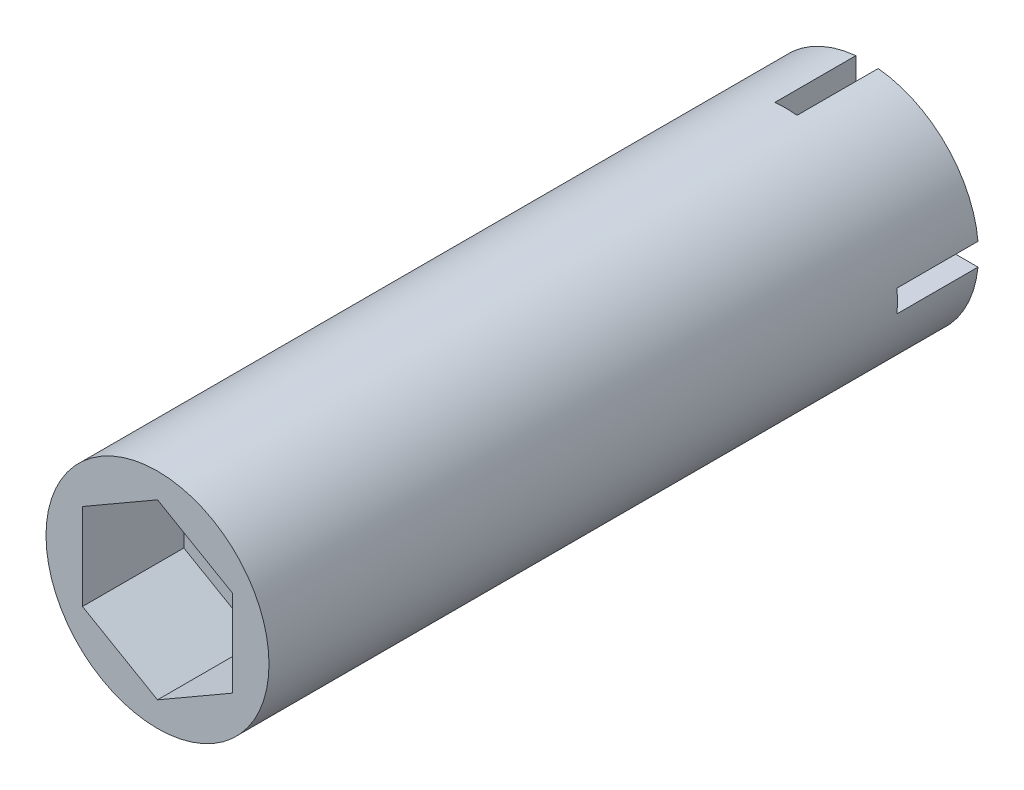
ISO-10303-21;
HEADER;
FILE_DESCRIPTION(('STEP AP214'),'2;1');
FILE_NAME('part.step','',(''),(''),'','','');
FILE_SCHEMA(('AUTOMOTIVE_DESIGN { 1 0 10303 214 1 1 1 1 }'));
ENDSEC;
DATA;
#1=APPLICATION_CONTEXT('core data for automotive mechanical design processes');
#2=APPLICATION_PROTOCOL_DEFINITION('international standard','automotive_design',2000,#1);
#3=PRODUCT_CONTEXT('',#1,'mechanical');
#4=PRODUCT('Part','Part','',(#3));
#5=PRODUCT_RELATED_PRODUCT_CATEGORY('part','',(#4));
#6=PRODUCT_DEFINITION_FORMATION('','',#4);
#7=PRODUCT_DEFINITION_CONTEXT('part definition',#1,'design');
#8=PRODUCT_DEFINITION('design','',#6,#7);
#9=PRODUCT_DEFINITION_SHAPE('','',#8);
#10=(LENGTH_UNIT() NAMED_UNIT(*) SI_UNIT(.MILLI.,.METRE.));
#11=(NAMED_UNIT(*) PLANE_ANGLE_UNIT() SI_UNIT($,.RADIAN.));
#12=(NAMED_UNIT(*) SI_UNIT($,.STERADIAN.) SOLID_ANGLE_UNIT());
#13=UNCERTAINTY_MEASURE_WITH_UNIT(LENGTH_MEASURE(1.E-05),#10,'distance_accuracy_value','');
#14=(GEOMETRIC_REPRESENTATION_CONTEXT(3) GLOBAL_UNCERTAINTY_ASSIGNED_CONTEXT((#13)) GLOBAL_UNIT_ASSIGNED_CONTEXT((#10,
#11,#12)) REPRESENTATION_CONTEXT('',''));
#15=CARTESIAN_POINT('',(0.,0.,0.));
#16=DIRECTION('',(0.,0.,1.));
#17=DIRECTION('',(1.,0.,0.));
#18=AXIS2_PLACEMENT_3D('',#15,#16,#17);
#19=CARTESIAN_POINT('',(0.,0.,0.));
#20=DIRECTION('',(0.,0.,1.));
#21=DIRECTION('',(1.,0.,0.));
#22=AXIS2_PLACEMENT_3D('',#19,#20,#21);
#23=PLANE('',#22);
#24=CARTESIAN_POINT('',(0.,0.,0.));
#25=DIRECTION('',(0.,0.,1.));
#26=DIRECTION('',(1.,0.,0.));
#27=AXIS2_PLACEMENT_3D('',#24,#25,#26);
#28=CIRCLE('',#27,2.25);
#29=CARTESIAN_POINT('',(2.18174242292714,0.55,0.));
#30=VERTEX_POINT('',#29);
#31=CARTESIAN_POINT('',(0.55,2.18174242292714,0.));
#32=VERTEX_POINT('',#31);
#33=EDGE_CURVE('E209',#30,#32,#28,.T.);
#34=ORIENTED_EDGE('',*,*,#33,.T.);
#35=DIRECTION('',(0.,-1.,0.));
#36=VECTOR('',#35,1.);
#37=CARTESIAN_POINT('',(0.55,5.5,0.));
#38=LINE('',#37,#36);
#39=CARTESIAN_POINT('',(0.55,5.47243090408641,0.));
#40=VERTEX_POINT('',#39);
#41=EDGE_CURVE('E193',#40,#32,#38,.T.);
#42=ORIENTED_EDGE('',*,*,#41,.F.);
#43=CARTESIAN_POINT('',(0.,0.,0.));
#44=DIRECTION('',(0.,0.,1.));
#45=DIRECTION('',(1.,0.,0.));
#46=AXIS2_PLACEMENT_3D('',#43,#44,#45);
#47=CIRCLE('',#46,5.5);
#48=CARTESIAN_POINT('',(5.47243090408641,0.55,0.));
#49=VERTEX_POINT('',#48);
#50=EDGE_CURVE('E207',#49,#40,#47,.T.);
#51=ORIENTED_EDGE('',*,*,#50,.F.);
#52=DIRECTION('',(1.,0.,0.));
#53=VECTOR('',#52,1.);
#54=CARTESIAN_POINT('',(5.5,0.55,0.));
#55=LINE('',#54,#53);
#56=EDGE_CURVE('E211',#30,#49,#55,.T.);
#57=ORIENTED_EDGE('',*,*,#56,.F.);
#58=EDGE_LOOP('',(#34,#42,#51,#57));
#59=FACE_BOUND('',#58,.T.);
#60=ADVANCED_FACE('F39',(#59),#23,.F.);
#61=CARTESIAN_POINT('',(-0.55,5.47243090408641,0.));
#62=VERTEX_POINT('',#61);
#63=CARTESIAN_POINT('',(-5.47243090408641,0.55,0.));
#64=VERTEX_POINT('',#63);
#65=EDGE_CURVE('E219',#62,#64,#47,.T.);
#66=ORIENTED_EDGE('',*,*,#65,.F.);
#67=DIRECTION('',(0.,1.,0.));
#68=VECTOR('',#67,1.);
#69=CARTESIAN_POINT('',(-0.55,5.5,0.));
#70=LINE('',#69,#68);
#71=CARTESIAN_POINT('',(-0.550000000000001,2.18174242292714,0.));
#72=VERTEX_POINT('',#71);
#73=EDGE_CURVE('E381',#72,#62,#70,.T.);
#74=ORIENTED_EDGE('',*,*,#73,.F.);
#75=CARTESIAN_POINT('',(-2.18174242292714,0.55,0.));
#76=VERTEX_POINT('',#75);
#77=EDGE_CURVE('E412',#72,#76,#28,.T.);
#78=ORIENTED_EDGE('',*,*,#77,.T.);
#79=DIRECTION('',(1.,0.,0.));
#80=VECTOR('',#79,1.);
#81=CARTESIAN_POINT('',(-0.550000000000001,0.55,0.));
#82=LINE('',#81,#80);
#83=EDGE_CURVE('E378',#64,#76,#82,.T.);
#84=ORIENTED_EDGE('',*,*,#83,.F.);
#85=EDGE_LOOP('',(#66,#74,#78,#84));
#86=FACE_BOUND('',#85,.T.);
#87=ADVANCED_FACE('F343',(#86),#23,.F.);
#88=CARTESIAN_POINT('',(-5.47243090408641,-0.55,0.));
#89=VERTEX_POINT('',#88);
#90=CARTESIAN_POINT('',(-0.550000000000001,-5.47243090408641,0.));
#91=VERTEX_POINT('',#90);
#92=EDGE_CURVE('E228',#89,#91,#47,.T.);
#93=ORIENTED_EDGE('',*,*,#92,.F.);
#94=DIRECTION('',(-1.,0.,0.));
#95=VECTOR('',#94,1.);
#96=CARTESIAN_POINT('',(-0.550000000000001,-0.55,0.));
#97=LINE('',#96,#95);
#98=CARTESIAN_POINT('',(-2.18174242292714,-0.55,0.));
#99=VERTEX_POINT('',#98);
#100=EDGE_CURVE('E375',#99,#89,#97,.T.);
#101=ORIENTED_EDGE('',*,*,#100,.F.);
#102=CARTESIAN_POINT('',(-0.550000000000001,-2.18174242292714,0.));
#103=VERTEX_POINT('',#102);
#104=EDGE_CURVE('E415',#99,#103,#28,.T.);
#105=ORIENTED_EDGE('',*,*,#104,.T.);
#106=DIRECTION('',(0.,1.,0.));
#107=VECTOR('',#106,1.);
#108=CARTESIAN_POINT('',(-0.550000000000001,-0.55,0.));
#109=LINE('',#108,#107);
#110=EDGE_CURVE('E369',#91,#103,#109,.T.);
#111=ORIENTED_EDGE('',*,*,#110,.F.);
#112=EDGE_LOOP('',(#93,#101,#105,#111));
#113=FACE_BOUND('',#112,.T.);
#114=ADVANCED_FACE('F339',(#113),#23,.F.);
#115=CARTESIAN_POINT('',(0.,0.,35.));
#116=DIRECTION('',(0.,0.,-1.));
#117=DIRECTION('',(-1.,0.,0.));
#118=AXIS2_PLACEMENT_3D('',#115,#116,#117);
#119=CYLINDRICAL_SURFACE('',#118,5.5);
#120=ORIENTED_EDGE('',*,*,#50,.T.);
#121=DIRECTION('',(0.,0.,-1.));
#122=VECTOR('',#121,1.);
#123=CARTESIAN_POINT('',(0.55,5.47243090408641,35.));
#124=LINE('',#123,#122);
#125=CARTESIAN_POINT('',(0.55,5.47243090408641,4.));
#126=VERTEX_POINT('',#125);
#127=EDGE_CURVE('E189',#40,#126,#124,.F.);
#128=ORIENTED_EDGE('',*,*,#127,.T.);
#129=CARTESIAN_POINT('',(0.,0.,4.));
#130=DIRECTION('',(0.,0.,-1.));
#131=DIRECTION('',(-1.,0.,0.));
#132=AXIS2_PLACEMENT_3D('',#129,#130,#131);
#133=CIRCLE('',#132,5.5);
#134=CARTESIAN_POINT('',(-0.55,5.47243090408641,4.));
#135=VERTEX_POINT('',#134);
#136=EDGE_CURVE('E384',#135,#126,#133,.T.);
#137=ORIENTED_EDGE('',*,*,#136,.F.);
#138=DIRECTION('',(0.,0.,-1.));
#139=VECTOR('',#138,1.);
#140=CARTESIAN_POINT('',(-0.55,5.47243090408641,35.));
#141=LINE('',#140,#139);
#142=EDGE_CURVE('E201',#135,#62,#141,.T.);
#143=ORIENTED_EDGE('',*,*,#142,.T.);
#144=ORIENTED_EDGE('',*,*,#65,.T.);
#145=DIRECTION('',(0.,0.,-1.));
#146=VECTOR('',#145,1.);
#147=CARTESIAN_POINT('',(-5.47243090408641,0.55,35.));
#148=LINE('',#147,#146);
#149=CARTESIAN_POINT('',(-5.47243090408641,0.55,4.));
#150=VERTEX_POINT('',#149);
#151=EDGE_CURVE('E405',#64,#150,#148,.F.);
#152=ORIENTED_EDGE('',*,*,#151,.T.);
#153=CARTESIAN_POINT('',(-5.47243090408641,-0.55,4.));
#154=VERTEX_POINT('',#153);
#155=EDGE_CURVE('E388',#154,#150,#133,.T.);
#156=ORIENTED_EDGE('',*,*,#155,.F.);
#157=DIRECTION('',(0.,0.,-1.));
#158=VECTOR('',#157,1.);
#159=CARTESIAN_POINT('',(-5.47243090408641,-0.55,35.));
#160=LINE('',#159,#158);
#161=EDGE_CURVE('E401',#154,#89,#160,.T.);
#162=ORIENTED_EDGE('',*,*,#161,.T.);
#163=ORIENTED_EDGE('',*,*,#92,.T.);
#164=DIRECTION('',(0.,0.,-1.));
#165=VECTOR('',#164,1.);
#166=CARTESIAN_POINT('',(-0.550000000000001,-5.47243090408641,35.));
#167=LINE('',#166,#165);
#168=CARTESIAN_POINT('',(-0.550000000000001,-5.47243090408641,4.));
#169=VERTEX_POINT('',#168);
#170=EDGE_CURVE('E397',#91,#169,#167,.F.);
#171=ORIENTED_EDGE('',*,*,#170,.T.);
#172=CARTESIAN_POINT('',(0.549999999999998,-5.47243090408641,4.));
#173=VERTEX_POINT('',#172);
#174=EDGE_CURVE('E604',#173,#169,#133,.T.);
#175=ORIENTED_EDGE('',*,*,#174,.F.);
#176=DIRECTION('',(0.,0.,-1.));
#177=VECTOR('',#176,1.);
#178=CARTESIAN_POINT('',(0.549999999999998,-5.47243090408641,35.));
#179=LINE('',#178,#177);
#180=CARTESIAN_POINT('',(0.549999999999998,-5.47243090408641,0.));
#181=VERTEX_POINT('',#180);
#182=EDGE_CURVE('E394',#173,#181,#179,.T.);
#183=ORIENTED_EDGE('',*,*,#182,.T.);
#184=CARTESIAN_POINT('',(5.47243090408641,-0.55,0.));
#185=VERTEX_POINT('',#184);
#186=EDGE_CURVE('E221',#181,#185,#47,.T.);
#187=ORIENTED_EDGE('',*,*,#186,.T.);
#188=DIRECTION('',(0.,0.,-1.));
#189=VECTOR('',#188,1.);
#190=CARTESIAN_POINT('',(5.47243090408641,-0.55,35.));
#191=LINE('',#190,#189);
#192=CARTESIAN_POINT('',(5.47243090408641,-0.55,4.));
#193=VERTEX_POINT('',#192);
#194=EDGE_CURVE('E391',#185,#193,#191,.F.);
#195=ORIENTED_EDGE('',*,*,#194,.T.);
#196=CARTESIAN_POINT('',(5.47243090408641,0.55,4.));
#197=VERTEX_POINT('',#196);
#198=EDGE_CURVE('E387',#197,#193,#133,.T.);
#199=ORIENTED_EDGE('',*,*,#198,.F.);
#200=DIRECTION('',(0.,0.,-1.));
#201=VECTOR('',#200,1.);
#202=CARTESIAN_POINT('',(5.47243090408641,0.55,35.));
#203=LINE('',#202,#201);
#204=EDGE_CURVE('E216',#197,#49,#203,.T.);
#205=ORIENTED_EDGE('',*,*,#204,.T.);
#206=EDGE_LOOP('',(#120,#128,#137,#143,#144,#152,#156,#162,#163,#171,#175,#183,#187,#195,#199,#205));
#207=FACE_BOUND('',#206,.T.);
#208=CARTESIAN_POINT('',(0.,0.,35.));
#209=DIRECTION('',(0.,0.,1.));
#210=DIRECTION('',(1.,0.,0.));
#211=AXIS2_PLACEMENT_3D('',#208,#209,#210);
#212=CIRCLE('',#211,5.5);
#213=CARTESIAN_POINT('',(5.5,0.,35.));
#214=VERTEX_POINT('',#213);
#215=EDGE_CURVE('E218',#214,#214,#212,.T.);
#216=ORIENTED_EDGE('',*,*,#215,.F.);
#217=EDGE_LOOP('',(#216));
#218=FACE_BOUND('',#217,.T.);
#219=ADVANCED_FACE('F41',(#207,#218),#119,.T.);
#220=CARTESIAN_POINT('',(0.,0.,35.));
#221=DIRECTION('',(0.,0.,1.));
#222=DIRECTION('',(1.,0.,0.));
#223=AXIS2_PLACEMENT_3D('',#220,#221,#222);
#224=PLANE('',#223);
#225=DIRECTION('',(0.866025403784438,-0.5,0.));
#226=VECTOR('',#225,1.);
#227=CARTESIAN_POINT('',(-3.7,-2.13619599600162,35.));
#228=LINE('',#227,#226);
#229=CARTESIAN_POINT('',(-3.7,-2.13619599600162,35.));
#230=VERTEX_POINT('',#229);
#231=CARTESIAN_POINT('',(0.,-4.27239199200323,35.));
#232=VERTEX_POINT('',#231);
#233=EDGE_CURVE('E280',#230,#232,#228,.T.);
#234=ORIENTED_EDGE('',*,*,#233,.F.);
#235=DIRECTION('',(0.,-1.,0.));
#236=VECTOR('',#235,1.);
#237=CARTESIAN_POINT('',(-3.7,2.13619599600162,35.));
#238=LINE('',#237,#236);
#239=CARTESIAN_POINT('',(-3.7,2.13619599600162,35.));
#240=VERTEX_POINT('',#239);
#241=EDGE_CURVE('E248',#240,#230,#238,.T.);
#242=ORIENTED_EDGE('',*,*,#241,.F.);
#243=DIRECTION('',(-0.866025403784439,-0.5,0.));
#244=VECTOR('',#243,1.);
#245=CARTESIAN_POINT('',(0.,4.27239199200323,35.));
#246=LINE('',#245,#244);
#247=CARTESIAN_POINT('',(0.,4.27239199200323,35.));
#248=VERTEX_POINT('',#247);
#249=EDGE_CURVE('E293',#248,#240,#246,.T.);
#250=ORIENTED_EDGE('',*,*,#249,.F.);
#251=DIRECTION('',(-0.866025403784439,0.5,0.));
#252=VECTOR('',#251,1.);
#253=CARTESIAN_POINT('',(3.7,2.13619599600162,35.));
#254=LINE('',#253,#252);
#255=CARTESIAN_POINT('',(3.7,2.13619599600162,35.));
#256=VERTEX_POINT('',#255);
#257=EDGE_CURVE('E290',#256,#248,#254,.T.);
#258=ORIENTED_EDGE('',*,*,#257,.F.);
#259=DIRECTION('',(0.,1.,0.));
#260=VECTOR('',#259,1.);
#261=CARTESIAN_POINT('',(3.7,-2.13619599600162,35.));
#262=LINE('',#261,#260);
#263=CARTESIAN_POINT('',(3.7,-2.13619599600162,35.));
#264=VERTEX_POINT('',#263);
#265=EDGE_CURVE('E286',#264,#256,#262,.T.);
#266=ORIENTED_EDGE('',*,*,#265,.F.);
#267=DIRECTION('',(0.866025403784439,0.5,0.));
#268=VECTOR('',#267,1.);
#269=CARTESIAN_POINT('',(0.,-4.27239199200323,35.));
#270=LINE('',#269,#268);
#271=EDGE_CURVE('E283',#232,#264,#270,.T.);
#272=ORIENTED_EDGE('',*,*,#271,.F.);
#273=EDGE_LOOP('',(#234,#242,#250,#258,#266,#272));
#274=FACE_BOUND('',#273,.T.);
#275=ORIENTED_EDGE('',*,*,#215,.T.);
#276=EDGE_LOOP('',(#275));
#277=FACE_BOUND('',#276,.T.);
#278=ADVANCED_FACE('F332',(#274,#277),#224,.T.);
#279=ORIENTED_EDGE('',*,*,#186,.F.);
#280=DIRECTION('',(0.,-1.,0.));
#281=VECTOR('',#280,1.);
#282=CARTESIAN_POINT('',(0.549999999999999,-0.55,0.));
#283=LINE('',#282,#281);
#284=CARTESIAN_POINT('',(0.549999999999999,-2.18174242292714,0.));
#285=VERTEX_POINT('',#284);
#286=EDGE_CURVE('E359',#285,#181,#283,.T.);
#287=ORIENTED_EDGE('',*,*,#286,.F.);
#288=CARTESIAN_POINT('',(2.18174242292714,-0.55,0.));
#289=VERTEX_POINT('',#288);
#290=EDGE_CURVE('E362',#285,#289,#28,.T.);
#291=ORIENTED_EDGE('',*,*,#290,.T.);
#292=DIRECTION('',(-1.,0.,0.));
#293=VECTOR('',#292,1.);
#294=CARTESIAN_POINT('',(5.5,-0.55,0.));
#295=LINE('',#294,#293);
#296=EDGE_CURVE('E361',#185,#289,#295,.T.);
#297=ORIENTED_EDGE('',*,*,#296,.F.);
#298=EDGE_LOOP('',(#279,#287,#291,#297));
#299=FACE_BOUND('',#298,.T.);
#300=ADVANCED_FACE('F335',(#299),#23,.F.);
#301=CARTESIAN_POINT('',(-3.7,-2.13619599600162,30.));
#302=DIRECTION('',(-0.5,-0.866025403784439,0.));
#303=DIRECTION('',(0.866025403784439,-0.5,0.));
#304=AXIS2_PLACEMENT_3D('',#301,#302,#303);
#305=PLANE('',#304);
#306=ORIENTED_EDGE('',*,*,#233,.T.);
#307=DIRECTION('',(0.,0.,1.));
#308=VECTOR('',#307,1.);
#309=CARTESIAN_POINT('',(0.,-4.27239199200323,30.));
#310=LINE('',#309,#308);
#311=CARTESIAN_POINT('',(0.,-4.27239199200323,30.));
#312=VERTEX_POINT('',#311);
#313=EDGE_CURVE('E259',#312,#232,#310,.T.);
#314=ORIENTED_EDGE('',*,*,#313,.F.);
#315=DIRECTION('',(0.866025403784438,-0.5,0.));
#316=VECTOR('',#315,1.);
#317=CARTESIAN_POINT('',(-3.7,-2.13619599600162,30.));
#318=LINE('',#317,#316);
#319=CARTESIAN_POINT('',(-3.7,-2.13619599600162,30.));
#320=VERTEX_POINT('',#319);
#321=EDGE_CURVE('E300',#320,#312,#318,.T.);
#322=ORIENTED_EDGE('',*,*,#321,.F.);
#323=DIRECTION('',(0.,0.,1.));
#324=VECTOR('',#323,1.);
#325=CARTESIAN_POINT('',(-3.7,-2.13619599600162,30.));
#326=LINE('',#325,#324);
#327=EDGE_CURVE('E232',#320,#230,#326,.T.);
#328=ORIENTED_EDGE('',*,*,#327,.T.);
#329=EDGE_LOOP('',(#306,#314,#322,#328));
#330=FACE_BOUND('',#329,.T.);
#331=ADVANCED_FACE('F326',(#330),#305,.F.);
#332=CARTESIAN_POINT('',(-3.7,2.13619599600162,30.));
#333=DIRECTION('',(-1.,0.,0.));
#334=DIRECTION('',(0.,-1.,0.));
#335=AXIS2_PLACEMENT_3D('',#332,#333,#334);
#336=PLANE('',#335);
#337=ORIENTED_EDGE('',*,*,#241,.T.);
#338=ORIENTED_EDGE('',*,*,#327,.F.);
#339=DIRECTION('',(0.,-1.,0.));
#340=VECTOR('',#339,1.);
#341=CARTESIAN_POINT('',(-3.7,2.13619599600162,30.));
#342=LINE('',#341,#340);
#343=CARTESIAN_POINT('',(-3.7,2.13619599600162,30.));
#344=VERTEX_POINT('',#343);
#345=EDGE_CURVE('E262',#344,#320,#342,.T.);
#346=ORIENTED_EDGE('',*,*,#345,.F.);
#347=DIRECTION('',(0.,0.,1.));
#348=VECTOR('',#347,1.);
#349=CARTESIAN_POINT('',(-3.7,2.13619599600162,30.));
#350=LINE('',#349,#348);
#351=EDGE_CURVE('E239',#344,#240,#350,.T.);
#352=ORIENTED_EDGE('',*,*,#351,.T.);
#353=EDGE_LOOP('',(#337,#338,#346,#352));
#354=FACE_BOUND('',#353,.T.);
#355=ADVANCED_FACE('F325',(#354),#336,.F.);
#356=CARTESIAN_POINT('',(0.,4.27239199200323,30.));
#357=DIRECTION('',(-0.5,0.866025403784439,0.));
#358=DIRECTION('',(-0.866025403784439,-0.5,0.));
#359=AXIS2_PLACEMENT_3D('',#356,#357,#358);
#360=PLANE('',#359);
#361=ORIENTED_EDGE('',*,*,#249,.T.);
#362=ORIENTED_EDGE('',*,*,#351,.F.);
#363=DIRECTION('',(-0.866025403784439,-0.5,0.));
#364=VECTOR('',#363,1.);
#365=CARTESIAN_POINT('',(0.,4.27239199200323,30.));
#366=LINE('',#365,#364);
#367=CARTESIAN_POINT('',(0.,4.27239199200323,30.));
#368=VERTEX_POINT('',#367);
#369=EDGE_CURVE('E269',#368,#344,#366,.T.);
#370=ORIENTED_EDGE('',*,*,#369,.F.);
#371=DIRECTION('',(0.,0.,1.));
#372=VECTOR('',#371,1.);
#373=CARTESIAN_POINT('',(0.,4.27239199200323,30.));
#374=LINE('',#373,#372);
#375=EDGE_CURVE('E245',#368,#248,#374,.T.);
#376=ORIENTED_EDGE('',*,*,#375,.T.);
#377=EDGE_LOOP('',(#361,#362,#370,#376));
#378=FACE_BOUND('',#377,.T.);
#379=ADVANCED_FACE('F324',(#378),#360,.F.);
#380=CARTESIAN_POINT('',(3.7,2.13619599600162,30.));
#381=DIRECTION('',(0.5,0.866025403784439,0.));
#382=DIRECTION('',(-0.866025403784439,0.5,0.));
#383=AXIS2_PLACEMENT_3D('',#380,#381,#382);
#384=PLANE('',#383);
#385=ORIENTED_EDGE('',*,*,#257,.T.);
#386=ORIENTED_EDGE('',*,*,#375,.F.);
#387=DIRECTION('',(-0.866025403784439,0.5,0.));
#388=VECTOR('',#387,1.);
#389=CARTESIAN_POINT('',(3.7,2.13619599600162,30.));
#390=LINE('',#389,#388);
#391=CARTESIAN_POINT('',(3.7,2.13619599600162,30.));
#392=VERTEX_POINT('',#391);
#393=EDGE_CURVE('E276',#392,#368,#390,.T.);
#394=ORIENTED_EDGE('',*,*,#393,.F.);
#395=DIRECTION('',(0.,0.,1.));
#396=VECTOR('',#395,1.);
#397=CARTESIAN_POINT('',(3.7,2.13619599600162,30.));
#398=LINE('',#397,#396);
#399=EDGE_CURVE('E253',#392,#256,#398,.T.);
#400=ORIENTED_EDGE('',*,*,#399,.T.);
#401=EDGE_LOOP('',(#385,#386,#394,#400));
#402=FACE_BOUND('',#401,.T.);
#403=ADVANCED_FACE('F322',(#402),#384,.F.);
#404=CARTESIAN_POINT('',(3.7,-2.13619599600162,30.));
#405=DIRECTION('',(1.,0.,0.));
#406=DIRECTION('',(0.,1.,0.));
#407=AXIS2_PLACEMENT_3D('',#404,#405,#406);
#408=PLANE('',#407);
#409=ORIENTED_EDGE('',*,*,#265,.T.);
#410=ORIENTED_EDGE('',*,*,#399,.F.);
#411=DIRECTION('',(0.,1.,0.));
#412=VECTOR('',#411,1.);
#413=CARTESIAN_POINT('',(3.7,-2.13619599600162,30.));
#414=LINE('',#413,#412);
#415=CARTESIAN_POINT('',(3.7,-2.13619599600162,30.));
#416=VERTEX_POINT('',#415);
#417=EDGE_CURVE('E308',#416,#392,#414,.T.);
#418=ORIENTED_EDGE('',*,*,#417,.F.);
#419=DIRECTION('',(0.,0.,1.));
#420=VECTOR('',#419,1.);
#421=CARTESIAN_POINT('',(3.7,-2.13619599600162,30.));
#422=LINE('',#421,#420);
#423=EDGE_CURVE('E256',#416,#264,#422,.T.);
#424=ORIENTED_EDGE('',*,*,#423,.T.);
#425=EDGE_LOOP('',(#409,#410,#418,#424));
#426=FACE_BOUND('',#425,.T.);
#427=ADVANCED_FACE('F330',(#426),#408,.F.);
#428=CARTESIAN_POINT('',(0.,-4.27239199200323,30.));
#429=DIRECTION('',(0.5,-0.866025403784439,0.));
#430=DIRECTION('',(0.866025403784439,0.5,0.));
#431=AXIS2_PLACEMENT_3D('',#428,#429,#430);
#432=PLANE('',#431);
#433=ORIENTED_EDGE('',*,*,#271,.T.);
#434=ORIENTED_EDGE('',*,*,#423,.F.);
#435=DIRECTION('',(0.866025403784439,0.5,0.));
#436=VECTOR('',#435,1.);
#437=CARTESIAN_POINT('',(0.,-4.27239199200323,30.));
#438=LINE('',#437,#436);
#439=EDGE_CURVE('E304',#312,#416,#438,.T.);
#440=ORIENTED_EDGE('',*,*,#439,.F.);
#441=ORIENTED_EDGE('',*,*,#313,.T.);
#442=EDGE_LOOP('',(#433,#434,#440,#441));
#443=FACE_BOUND('',#442,.T.);
#444=ADVANCED_FACE('F327',(#443),#432,.F.);
#445=CARTESIAN_POINT('',(0.,0.,30.));
#446=DIRECTION('',(0.,0.,1.));
#447=DIRECTION('',(1.,0.,0.));
#448=AXIS2_PLACEMENT_3D('',#445,#446,#447);
#449=PLANE('',#448);
#450=CARTESIAN_POINT('',(0.,0.,30.));
#451=DIRECTION('',(0.,0.,1.));
#452=DIRECTION('',(1.,0.,0.));
#453=AXIS2_PLACEMENT_3D('',#450,#451,#452);
#454=CIRCLE('',#453,2.25);
#455=CARTESIAN_POINT('',(2.25,0.,30.));
#456=VERTEX_POINT('',#455);
#457=EDGE_CURVE('E200',#456,#456,#454,.T.);
#458=ORIENTED_EDGE('',*,*,#457,.F.);
#459=EDGE_LOOP('',(#458));
#460=FACE_BOUND('',#459,.T.);
#461=ORIENTED_EDGE('',*,*,#321,.T.);
#462=ORIENTED_EDGE('',*,*,#439,.T.);
#463=ORIENTED_EDGE('',*,*,#417,.T.);
#464=ORIENTED_EDGE('',*,*,#393,.T.);
#465=ORIENTED_EDGE('',*,*,#369,.T.);
#466=ORIENTED_EDGE('',*,*,#345,.T.);
#467=EDGE_LOOP('',(#461,#462,#463,#464,#465,#466));
#468=FACE_BOUND('',#467,.T.);
#469=ADVANCED_FACE('F318',(#460,#468),#449,.T.);
#470=CARTESIAN_POINT('',(0.,0.,0.));
#471=DIRECTION('',(0.,0.,1.));
#472=DIRECTION('',(1.,0.,0.));
#473=AXIS2_PLACEMENT_3D('',#470,#471,#472);
#474=CYLINDRICAL_SURFACE('',#473,2.25);
#475=CARTESIAN_POINT('',(0.,0.,4.));
#476=DIRECTION('',(0.,0.,-1.));
#477=DIRECTION('',(-1.,0.,0.));
#478=AXIS2_PLACEMENT_3D('',#475,#476,#477);
#479=CIRCLE('',#478,2.25);
#480=CARTESIAN_POINT('',(-0.550000000000001,-2.18174242292714,4.));
#481=VERTEX_POINT('',#480);
#482=CARTESIAN_POINT('',(0.549999999999999,-2.18174242292714,4.));
#483=VERTEX_POINT('',#482);
#484=EDGE_CURVE('E619',#481,#483,#479,.F.);
#485=ORIENTED_EDGE('',*,*,#484,.F.);
#486=DIRECTION('',(0.,0.,1.));
#487=VECTOR('',#486,1.);
#488=CARTESIAN_POINT('',(-0.550000000000001,-2.18174242292714,0.));
#489=LINE('',#488,#487);
#490=EDGE_CURVE('E11',#481,#103,#489,.F.);
#491=ORIENTED_EDGE('',*,*,#490,.T.);
#492=ORIENTED_EDGE('',*,*,#104,.F.);
#493=DIRECTION('',(0.,0.,1.));
#494=VECTOR('',#493,1.);
#495=CARTESIAN_POINT('',(-2.18174242292714,-0.55,0.));
#496=LINE('',#495,#494);
#497=CARTESIAN_POINT('',(-2.18174242292714,-0.55,4.));
#498=VERTEX_POINT('',#497);
#499=EDGE_CURVE('E632',#99,#498,#496,.T.);
#500=ORIENTED_EDGE('',*,*,#499,.T.);
#501=CARTESIAN_POINT('',(-2.18174242292714,0.55,4.));
#502=VERTEX_POINT('',#501);
#503=EDGE_CURVE('E225',#502,#498,#479,.F.);
#504=ORIENTED_EDGE('',*,*,#503,.F.);
#505=DIRECTION('',(0.,0.,1.));
#506=VECTOR('',#505,1.);
#507=CARTESIAN_POINT('',(-2.18174242292714,0.55,0.));
#508=LINE('',#507,#506);
#509=EDGE_CURVE('E637',#502,#76,#508,.F.);
#510=ORIENTED_EDGE('',*,*,#509,.T.);
#511=ORIENTED_EDGE('',*,*,#77,.F.);
#512=DIRECTION('',(0.,0.,1.));
#513=VECTOR('',#512,1.);
#514=CARTESIAN_POINT('',(-0.550000000000001,2.18174242292714,0.));
#515=LINE('',#514,#513);
#516=CARTESIAN_POINT('',(-0.550000000000001,2.18174242292714,4.));
#517=VERTEX_POINT('',#516);
#518=EDGE_CURVE('E639',#72,#517,#515,.T.);
#519=ORIENTED_EDGE('',*,*,#518,.T.);
#520=CARTESIAN_POINT('',(0.55,2.18174242292714,4.));
#521=VERTEX_POINT('',#520);
#522=EDGE_CURVE('E630',#521,#517,#479,.F.);
#523=ORIENTED_EDGE('',*,*,#522,.F.);
#524=DIRECTION('',(0.,0.,1.));
#525=VECTOR('',#524,1.);
#526=CARTESIAN_POINT('',(0.55,2.18174242292714,0.));
#527=LINE('',#526,#525);
#528=EDGE_CURVE('E629',#521,#32,#527,.F.);
#529=ORIENTED_EDGE('',*,*,#528,.T.);
#530=ORIENTED_EDGE('',*,*,#33,.F.);
#531=DIRECTION('',(0.,0.,1.));
#532=VECTOR('',#531,1.);
#533=CARTESIAN_POINT('',(2.18174242292714,0.55,0.));
#534=LINE('',#533,#532);
#535=CARTESIAN_POINT('',(2.18174242292714,0.55,4.));
#536=VERTEX_POINT('',#535);
#537=EDGE_CURVE('E625',#30,#536,#534,.T.);
#538=ORIENTED_EDGE('',*,*,#537,.T.);
#539=CARTESIAN_POINT('',(2.18174242292714,-0.55,4.));
#540=VERTEX_POINT('',#539);
#541=EDGE_CURVE('E622',#540,#536,#479,.F.);
#542=ORIENTED_EDGE('',*,*,#541,.F.);
#543=DIRECTION('',(0.,0.,1.));
#544=VECTOR('',#543,1.);
#545=CARTESIAN_POINT('',(2.18174242292714,-0.55,0.));
#546=LINE('',#545,#544);
#547=EDGE_CURVE('E621',#540,#289,#546,.F.);
#548=ORIENTED_EDGE('',*,*,#547,.T.);
#549=ORIENTED_EDGE('',*,*,#290,.F.);
#550=DIRECTION('',(0.,0.,1.));
#551=VECTOR('',#550,1.);
#552=CARTESIAN_POINT('',(0.549999999999999,-2.18174242292714,0.));
#553=LINE('',#552,#551);
#554=EDGE_CURVE('E48',#285,#483,#553,.T.);
#555=ORIENTED_EDGE('',*,*,#554,.T.);
#556=EDGE_LOOP('',(#485,#491,#492,#500,#504,#510,#511,#519,#523,#529,#530,#538,#542,#548,#549,#555));
#557=FACE_BOUND('',#556,.T.);
#558=ORIENTED_EDGE('',*,*,#457,.T.);
#559=EDGE_LOOP('',(#558));
#560=FACE_BOUND('',#559,.T.);
#561=ADVANCED_FACE('F423',(#557,#560),#474,.F.);
#562=CARTESIAN_POINT('',(0.,0.,4.));
#563=DIRECTION('',(0.,0.,-1.));
#564=DIRECTION('',(-1.,0.,0.));
#565=AXIS2_PLACEMENT_3D('',#562,#563,#564);
#566=PLANE('',#565);
#567=ORIENTED_EDGE('',*,*,#155,.T.);
#568=DIRECTION('',(1.,0.,0.));
#569=VECTOR('',#568,1.);
#570=CARTESIAN_POINT('',(-0.550000000000001,0.55,4.));
#571=LINE('',#570,#569);
#572=EDGE_CURVE('E671',#150,#502,#571,.T.);
#573=ORIENTED_EDGE('',*,*,#572,.T.);
#574=ORIENTED_EDGE('',*,*,#503,.T.);
#575=DIRECTION('',(-1.,0.,0.));
#576=VECTOR('',#575,1.);
#577=CARTESIAN_POINT('',(-0.550000000000001,-0.55,4.));
#578=LINE('',#577,#576);
#579=EDGE_CURVE('E611',#498,#154,#578,.T.);
#580=ORIENTED_EDGE('',*,*,#579,.T.);
#581=EDGE_LOOP('',(#567,#573,#574,#580));
#582=FACE_BOUND('',#581,.T.);
#583=ADVANCED_FACE('F431',(#582),#566,.T.);
#584=CARTESIAN_POINT('',(-0.550000000000001,-0.55,4.));
#585=DIRECTION('',(0.,-1.,0.));
#586=DIRECTION('',(1.,0.,0.));
#587=AXIS2_PLACEMENT_3D('',#584,#585,#586);
#588=PLANE('',#587);
#589=ORIENTED_EDGE('',*,*,#579,.F.);
#590=ORIENTED_EDGE('',*,*,#499,.F.);
#591=ORIENTED_EDGE('',*,*,#100,.T.);
#592=ORIENTED_EDGE('',*,*,#161,.F.);
#593=EDGE_LOOP('',(#589,#590,#591,#592));
#594=FACE_BOUND('',#593,.T.);
#595=ADVANCED_FACE('F497',(#594),#588,.F.);
#596=CARTESIAN_POINT('',(-0.550000000000001,0.55,4.));
#597=DIRECTION('',(0.,1.,0.));
#598=DIRECTION('',(-1.,0.,0.));
#599=AXIS2_PLACEMENT_3D('',#596,#597,#598);
#600=PLANE('',#599);
#601=ORIENTED_EDGE('',*,*,#83,.T.);
#602=ORIENTED_EDGE('',*,*,#509,.F.);
#603=ORIENTED_EDGE('',*,*,#572,.F.);
#604=ORIENTED_EDGE('',*,*,#151,.F.);
#605=EDGE_LOOP('',(#601,#602,#603,#604));
#606=FACE_BOUND('',#605,.T.);
#607=ADVANCED_FACE('F509',(#606),#600,.F.);
#608=ORIENTED_EDGE('',*,*,#136,.T.);
#609=DIRECTION('',(0.,-1.,0.));
#610=VECTOR('',#609,1.);
#611=CARTESIAN_POINT('',(0.55,5.5,4.));
#612=LINE('',#611,#610);
#613=EDGE_CURVE('E195',#126,#521,#612,.T.);
#614=ORIENTED_EDGE('',*,*,#613,.T.);
#615=ORIENTED_EDGE('',*,*,#522,.T.);
#616=DIRECTION('',(0.,1.,0.));
#617=VECTOR('',#616,1.);
#618=CARTESIAN_POINT('',(-0.55,5.5,4.));
#619=LINE('',#618,#617);
#620=EDGE_CURVE('E674',#517,#135,#619,.T.);
#621=ORIENTED_EDGE('',*,*,#620,.T.);
#622=EDGE_LOOP('',(#608,#614,#615,#621));
#623=FACE_BOUND('',#622,.T.);
#624=ADVANCED_FACE('F500',(#623),#566,.T.);
#625=CARTESIAN_POINT('',(-0.55,5.5,4.));
#626=DIRECTION('',(-1.,0.,0.));
#627=DIRECTION('',(0.,-1.,0.));
#628=AXIS2_PLACEMENT_3D('',#625,#626,#627);
#629=PLANE('',#628);
#630=ORIENTED_EDGE('',*,*,#620,.F.);
#631=ORIENTED_EDGE('',*,*,#518,.F.);
#632=ORIENTED_EDGE('',*,*,#73,.T.);
#633=ORIENTED_EDGE('',*,*,#142,.F.);
#634=EDGE_LOOP('',(#630,#631,#632,#633));
#635=FACE_BOUND('',#634,.T.);
#636=ADVANCED_FACE('F528',(#635),#629,.F.);
#637=CARTESIAN_POINT('',(0.55,5.5,4.));
#638=DIRECTION('',(1.,0.,0.));
#639=DIRECTION('',(0.,1.,0.));
#640=AXIS2_PLACEMENT_3D('',#637,#638,#639);
#641=PLANE('',#640);
#642=ORIENTED_EDGE('',*,*,#41,.T.);
#643=ORIENTED_EDGE('',*,*,#528,.F.);
#644=ORIENTED_EDGE('',*,*,#613,.F.);
#645=ORIENTED_EDGE('',*,*,#127,.F.);
#646=EDGE_LOOP('',(#642,#643,#644,#645));
#647=FACE_BOUND('',#646,.T.);
#648=ADVANCED_FACE('F191',(#647),#641,.F.);
#649=ORIENTED_EDGE('',*,*,#198,.T.);
#650=DIRECTION('',(-1.,0.,0.));
#651=VECTOR('',#650,1.);
#652=CARTESIAN_POINT('',(5.5,-0.55,4.));
#653=LINE('',#652,#651);
#654=EDGE_CURVE('E63',#193,#540,#653,.T.);
#655=ORIENTED_EDGE('',*,*,#654,.T.);
#656=ORIENTED_EDGE('',*,*,#541,.T.);
#657=DIRECTION('',(1.,0.,0.));
#658=VECTOR('',#657,1.);
#659=CARTESIAN_POINT('',(5.5,0.55,4.));
#660=LINE('',#659,#658);
#661=EDGE_CURVE('E659',#536,#197,#660,.T.);
#662=ORIENTED_EDGE('',*,*,#661,.T.);
#663=EDGE_LOOP('',(#649,#655,#656,#662));
#664=FACE_BOUND('',#663,.T.);
#665=ADVANCED_FACE('F530',(#664),#566,.T.);
#666=CARTESIAN_POINT('',(5.5,0.55,4.));
#667=DIRECTION('',(0.,1.,0.));
#668=DIRECTION('',(-1.,0.,0.));
#669=AXIS2_PLACEMENT_3D('',#666,#667,#668);
#670=PLANE('',#669);
#671=ORIENTED_EDGE('',*,*,#661,.F.);
#672=ORIENTED_EDGE('',*,*,#537,.F.);
#673=ORIENTED_EDGE('',*,*,#56,.T.);
#674=ORIENTED_EDGE('',*,*,#204,.F.);
#675=EDGE_LOOP('',(#671,#672,#673,#674));
#676=FACE_BOUND('',#675,.T.);
#677=ADVANCED_FACE('F554',(#676),#670,.F.);
#678=CARTESIAN_POINT('',(5.5,-0.55,4.));
#679=DIRECTION('',(0.,-1.,0.));
#680=DIRECTION('',(0.,0.,-1.));
#681=AXIS2_PLACEMENT_3D('',#678,#679,#680);
#682=PLANE('',#681);
#683=ORIENTED_EDGE('',*,*,#296,.T.);
#684=ORIENTED_EDGE('',*,*,#547,.F.);
#685=ORIENTED_EDGE('',*,*,#654,.F.);
#686=ORIENTED_EDGE('',*,*,#194,.F.);
#687=EDGE_LOOP('',(#683,#684,#685,#686));
#688=FACE_BOUND('',#687,.T.);
#689=ADVANCED_FACE('F562',(#688),#682,.F.);
#690=CARTESIAN_POINT('',(-0.550000000000001,-0.55,4.));
#691=DIRECTION('',(-1.,0.,0.));
#692=DIRECTION('',(0.,-1.,0.));
#693=AXIS2_PLACEMENT_3D('',#690,#691,#692);
#694=PLANE('',#693);
#695=ORIENTED_EDGE('',*,*,#110,.T.);
#696=ORIENTED_EDGE('',*,*,#490,.F.);
#697=DIRECTION('',(0.,1.,0.));
#698=VECTOR('',#697,1.);
#699=CARTESIAN_POINT('',(-0.550000000000001,-0.55,4.));
#700=LINE('',#699,#698);
#701=EDGE_CURVE('E55',#169,#481,#700,.T.);
#702=ORIENTED_EDGE('',*,*,#701,.F.);
#703=ORIENTED_EDGE('',*,*,#170,.F.);
#704=EDGE_LOOP('',(#695,#696,#702,#703));
#705=FACE_BOUND('',#704,.T.);
#706=ADVANCED_FACE('F572',(#705),#694,.F.);
#707=CARTESIAN_POINT('',(0.549999999999999,-0.55,4.));
#708=DIRECTION('',(1.,0.,0.));
#709=DIRECTION('',(0.,1.,0.));
#710=AXIS2_PLACEMENT_3D('',#707,#708,#709);
#711=PLANE('',#710);
#712=DIRECTION('',(0.,-1.,0.));
#713=VECTOR('',#712,1.);
#714=CARTESIAN_POINT('',(0.549999999999999,-0.55,4.));
#715=LINE('',#714,#713);
#716=EDGE_CURVE('E606',#483,#173,#715,.T.);
#717=ORIENTED_EDGE('',*,*,#716,.F.);
#718=ORIENTED_EDGE('',*,*,#554,.F.);
#719=ORIENTED_EDGE('',*,*,#286,.T.);
#720=ORIENTED_EDGE('',*,*,#182,.F.);
#721=EDGE_LOOP('',(#717,#718,#719,#720));
#722=FACE_BOUND('',#721,.T.);
#723=ADVANCED_FACE('F581',(#722),#711,.F.);
#724=ORIENTED_EDGE('',*,*,#174,.T.);
#725=ORIENTED_EDGE('',*,*,#701,.T.);
#726=ORIENTED_EDGE('',*,*,#484,.T.);
#727=ORIENTED_EDGE('',*,*,#716,.T.);
#728=EDGE_LOOP('',(#724,#725,#726,#727));
#729=FACE_BOUND('',#728,.T.);
#730=ADVANCED_FACE('F501',(#729),#566,.T.);
#731=CLOSED_SHELL('',(#60,#87,#114,#219,#278,#300,#331,#355,#379,#403,#427,#444,#469,#561,#583,
#595,#607,#624,#636,#648,#665,#677,#689,#706,#723,#730));
#732=MANIFOLD_SOLID_BREP('B2',#731);
#733=ADVANCED_BREP_SHAPE_REPRESENTATION('',(#18,#732),#14);
#734=SHAPE_DEFINITION_REPRESENTATION(#9,#733);
ENDSEC;
END-ISO-10303-21;
